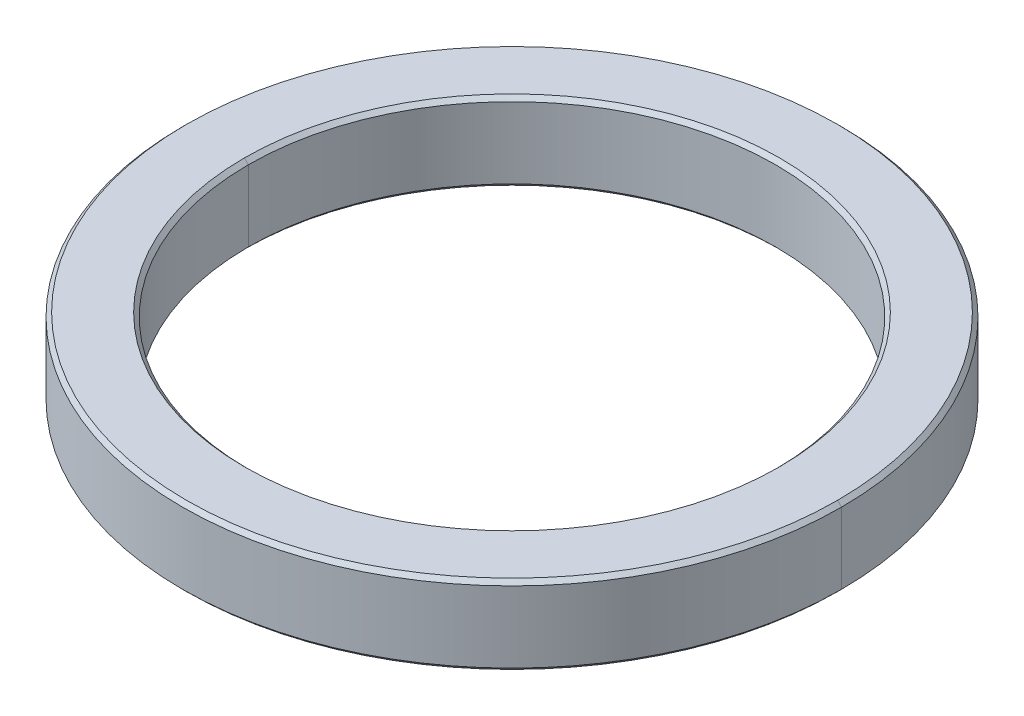
ISO-10303-21;
HEADER;
FILE_DESCRIPTION(('STEP AP214'),'2;1');
FILE_NAME('part.step','',(''),(''),'','','');
FILE_SCHEMA(('AUTOMOTIVE_DESIGN { 1 0 10303 214 1 1 1 1 }'));
ENDSEC;
DATA;
#1=APPLICATION_CONTEXT('core data for automotive mechanical design processes');
#2=APPLICATION_PROTOCOL_DEFINITION('international standard','automotive_design',2000,#1);
#3=PRODUCT_CONTEXT('',#1,'mechanical');
#4=PRODUCT('Part','Part','',(#3));
#5=PRODUCT_RELATED_PRODUCT_CATEGORY('part','',(#4));
#6=PRODUCT_DEFINITION_FORMATION('','',#4);
#7=PRODUCT_DEFINITION_CONTEXT('part definition',#1,'design');
#8=PRODUCT_DEFINITION('design','',#6,#7);
#9=PRODUCT_DEFINITION_SHAPE('','',#8);
#10=(LENGTH_UNIT() NAMED_UNIT(*) SI_UNIT(.MILLI.,.METRE.));
#11=(NAMED_UNIT(*) PLANE_ANGLE_UNIT() SI_UNIT($,.RADIAN.));
#12=(NAMED_UNIT(*) SI_UNIT($,.STERADIAN.) SOLID_ANGLE_UNIT());
#13=UNCERTAINTY_MEASURE_WITH_UNIT(LENGTH_MEASURE(1.E-05),#10,'distance_accuracy_value','');
#14=(GEOMETRIC_REPRESENTATION_CONTEXT(3) GLOBAL_UNCERTAINTY_ASSIGNED_CONTEXT((#13)) GLOBAL_UNIT_ASSIGNED_CONTEXT((#10,
#11,#12)) REPRESENTATION_CONTEXT('',''));
#15=CARTESIAN_POINT('',(0.,0.,0.));
#16=DIRECTION('',(0.,0.,1.));
#17=DIRECTION('',(1.,0.,0.));
#18=AXIS2_PLACEMENT_3D('',#15,#16,#17);
#19=CARTESIAN_POINT('',(0.,0.,0.));
#20=DIRECTION('',(0.,1.,0.));
#21=DIRECTION('',(1.,0.,0.));
#22=AXIS2_PLACEMENT_3D('',#19,#20,#21);
#23=PLANE('',#22);
#24=CARTESIAN_POINT('',(0.,-2.110311925207E-12,0.));
#25=DIRECTION('',(0.,1.,0.));
#26=DIRECTION('',(0.,0.,-1.));
#27=AXIS2_PLACEMENT_3D('',#24,#25,#26);
#28=CIRCLE('',#27,24.7);
#29=CARTESIAN_POINT('',(0.,-2.110311925207E-12,-24.7));
#30=VERTEX_POINT('',#29);
#31=CARTESIAN_POINT('',(-24.7,-2.046363078989E-12,-2.5055922655E-13));
#32=VERTEX_POINT('',#31);
#33=EDGE_CURVE('E42',#30,#32,#28,.T.);
#34=ORIENTED_EDGE('',*,*,#33,.F.);
#35=CARTESIAN_POINT('',(0.,-2.110311925207E-12,0.));
#36=DIRECTION('',(0.,1.,0.));
#37=DIRECTION('',(1.,0.,0.));
#38=AXIS2_PLACEMENT_3D('',#35,#36,#37);
#39=CIRCLE('',#38,24.7);
#40=CARTESIAN_POINT('',(24.7,-2.046363078989E-12,0.));
#41=VERTEX_POINT('',#40);
#42=EDGE_CURVE('E196',#41,#30,#39,.T.);
#43=ORIENTED_EDGE('',*,*,#42,.F.);
#44=CARTESIAN_POINT('',(0.,-2.046363078989E-12,-2.520731328245E-13));
#45=DIRECTION('',(0.,1.,0.));
#46=DIRECTION('',(0.,0.,1.));
#47=AXIS2_PLACEMENT_3D('',#44,#45,#46);
#48=CIRCLE('',#47,24.7);
#49=CARTESIAN_POINT('',(0.,-2.046363078989E-12,24.7));
#50=VERTEX_POINT('',#49);
#51=EDGE_CURVE('E193',#50,#41,#48,.T.);
#52=ORIENTED_EDGE('',*,*,#51,.F.);
#53=CARTESIAN_POINT('',(0.,-2.046363078989E-12,-2.520731328245E-13));
#54=DIRECTION('',(0.,1.,0.));
#55=DIRECTION('',(-1.,0.,0.));
#56=AXIS2_PLACEMENT_3D('',#53,#54,#55);
#57=CIRCLE('',#56,24.7);
#58=EDGE_CURVE('E28',#32,#50,#57,.T.);
#59=ORIENTED_EDGE('',*,*,#58,.F.);
#60=EDGE_LOOP('',(#34,#43,#52,#59));
#61=FACE_BOUND('',#60,.T.);
#62=CARTESIAN_POINT('',(0.,-1.566746732351E-12,0.));
#63=DIRECTION('',(0.,-1.,0.));
#64=DIRECTION('',(0.,0.,-1.));
#65=AXIS2_PLACEMENT_3D('',#62,#63,#64);
#66=CIRCLE('',#65,20.3);
#67=CARTESIAN_POINT('',(0.,-1.566746732351E-12,-20.3));
#68=VERTEX_POINT('',#67);
#69=CARTESIAN_POINT('',(20.3,-1.566746732351E-12,0.));
#70=VERTEX_POINT('',#69);
#71=EDGE_CURVE('E235',#68,#70,#66,.T.);
#72=ORIENTED_EDGE('',*,*,#71,.F.);
#73=CARTESIAN_POINT('',(0.,-1.566746732351E-12,0.));
#74=DIRECTION('',(0.,-1.,0.));
#75=DIRECTION('',(-1.,0.,0.));
#76=AXIS2_PLACEMENT_3D('',#73,#74,#75);
#77=CIRCLE('',#76,20.3);
#78=CARTESIAN_POINT('',(-20.3,-1.566746732351E-12,0.));
#79=VERTEX_POINT('',#78);
#80=EDGE_CURVE('E21',#79,#68,#77,.T.);
#81=ORIENTED_EDGE('',*,*,#80,.F.);
#82=CARTESIAN_POINT('',(0.,-1.566746732351E-12,0.));
#83=DIRECTION('',(0.,-1.,0.));
#84=DIRECTION('',(0.,0.,1.));
#85=AXIS2_PLACEMENT_3D('',#82,#83,#84);
#86=CIRCLE('',#85,20.3);
#87=CARTESIAN_POINT('',(0.,-1.566746732351E-12,20.3));
#88=VERTEX_POINT('',#87);
#89=EDGE_CURVE('E272',#88,#79,#86,.T.);
#90=ORIENTED_EDGE('',*,*,#89,.F.);
#91=CARTESIAN_POINT('',(0.,-1.566746732351E-12,0.));
#92=DIRECTION('',(0.,-1.,0.));
#93=DIRECTION('',(1.,0.,0.));
#94=AXIS2_PLACEMENT_3D('',#91,#92,#93);
#95=CIRCLE('',#94,20.3);
#96=EDGE_CURVE('E276',#70,#88,#95,.T.);
#97=ORIENTED_EDGE('',*,*,#96,.F.);
#98=EDGE_LOOP('',(#72,#81,#90,#97));
#99=FACE_BOUND('',#98,.T.);
#100=ADVANCED_FACE('F17',(#61,#99),#23,.F.);
#101=CARTESIAN_POINT('',(0.,0.149999999998,-2.520731328245E-13));
#102=DIRECTION('',(0.,1.,0.));
#103=DIRECTION('',(0.,0.,-1.));
#104=AXIS2_PLACEMENT_3D('',#101,#102,#103);
#105=CONICAL_SURFACE('',#104,24.85,0.7853981633973);
#106=DIRECTION('',(-0.707106781185698,-0.707106781187397,-1.254819780811E-09));
#107=VECTOR('',#106,1.);
#108=CARTESIAN_POINT('',(25.,0.2999999999991,-1.67764101897E-09));
#109=LINE('',#108,#107);
#110=CARTESIAN_POINT('',(25.,0.2999999999981,0.));
#111=VERTEX_POINT('',#110);
#112=EDGE_CURVE('E201',#111,#41,#109,.T.);
#113=ORIENTED_EDGE('',*,*,#112,.F.);
#114=CARTESIAN_POINT('',(0.,0.2999999999981,-2.520731328245E-13));
#115=DIRECTION('',(0.,1.,0.));
#116=DIRECTION('',(0.,0.,1.));
#117=AXIS2_PLACEMENT_3D('',#114,#115,#116);
#118=CIRCLE('',#117,25.);
#119=CARTESIAN_POINT('',(0.,0.2999999999981,25.));
#120=VERTEX_POINT('',#119);
#121=EDGE_CURVE('E214',#120,#111,#118,.T.);
#122=ORIENTED_EDGE('',*,*,#121,.F.);
#123=CARTESIAN_POINT('',(0.,0.2999999999981,-2.520731328245E-13));
#124=DIRECTION('',(0.,1.,0.));
#125=DIRECTION('',(-1.,0.,1.151365354006E-10));
#126=AXIS2_PLACEMENT_3D('',#123,#124,#125);
#127=CIRCLE('',#126,25.);
#128=CARTESIAN_POINT('',(-25.,0.2999999999991,3.116729008137E-09));
#129=VERTEX_POINT('',#128);
#130=EDGE_CURVE('E216',#129,#120,#127,.T.);
#131=ORIENTED_EDGE('',*,*,#130,.F.);
#132=DIRECTION('',(0.707106781185698,-0.707106781187397,-2.137327921652E-09));
#133=VECTOR('',#132,1.);
#134=CARTESIAN_POINT('',(-25.,0.2999999999991,3.116729008137E-09));
#135=LINE('',#134,#133);
#136=EDGE_CURVE('E11',#129,#32,#135,.T.);
#137=ORIENTED_EDGE('',*,*,#136,.T.);
#138=ORIENTED_EDGE('',*,*,#58,.T.);
#139=ORIENTED_EDGE('',*,*,#51,.T.);
#140=EDGE_LOOP('',(#113,#122,#131,#137,#138,#139));
#141=FACE_BOUND('',#140,.T.);
#142=ADVANCED_FACE('F203',(#141),#105,.T.);
#143=CARTESIAN_POINT('',(0.,0.1499999999979,0.));
#144=DIRECTION('',(0.,1.,0.));
#145=DIRECTION('',(0.,0.,-1.));
#146=AXIS2_PLACEMENT_3D('',#143,#144,#145);
#147=CONICAL_SURFACE('',#146,24.85,0.7853981633973);
#148=ORIENTED_EDGE('',*,*,#136,.F.);
#149=CARTESIAN_POINT('',(0.,0.2999999999979,0.));
#150=DIRECTION('',(0.,1.,0.));
#151=DIRECTION('',(0.,0.,-1.));
#152=AXIS2_PLACEMENT_3D('',#149,#150,#151);
#153=CIRCLE('',#152,25.);
#154=CARTESIAN_POINT('',(0.,0.2999999999979,-25.));
#155=VERTEX_POINT('',#154);
#156=EDGE_CURVE('E229',#155,#129,#153,.T.);
#157=ORIENTED_EDGE('',*,*,#156,.F.);
#158=CARTESIAN_POINT('',(0.,0.2999999999979,0.));
#159=DIRECTION('',(0.,1.,0.));
#160=DIRECTION('',(1.,0.,0.));
#161=AXIS2_PLACEMENT_3D('',#158,#159,#160);
#162=CIRCLE('',#161,25.);
#163=EDGE_CURVE('E233',#111,#155,#162,.T.);
#164=ORIENTED_EDGE('',*,*,#163,.F.);
#165=ORIENTED_EDGE('',*,*,#112,.T.);
#166=ORIENTED_EDGE('',*,*,#42,.T.);
#167=ORIENTED_EDGE('',*,*,#33,.T.);
#168=EDGE_LOOP('',(#148,#157,#164,#165,#166,#167));
#169=FACE_BOUND('',#168,.T.);
#170=ADVANCED_FACE('F375',(#169),#147,.T.);
#171=CARTESIAN_POINT('',(0.,0.,0.));
#172=DIRECTION('',(0.,1.,0.));
#173=DIRECTION('',(1.,0.,0.));
#174=AXIS2_PLACEMENT_3D('',#171,#172,#173);
#175=CYLINDRICAL_SURFACE('',#174,25.);
#176=DIRECTION('',(0.,-1.,0.));
#177=VECTOR('',#176,1.);
#178=CARTESIAN_POINT('',(25.,5.700000000001,-1.677645325336E-09));
#179=LINE('',#178,#177);
#180=CARTESIAN_POINT('',(25.,5.700000000002,0.));
#181=VERTEX_POINT('',#180);
#182=EDGE_CURVE('E256',#181,#111,#179,.T.);
#183=ORIENTED_EDGE('',*,*,#182,.T.);
#184=ORIENTED_EDGE('',*,*,#163,.T.);
#185=ORIENTED_EDGE('',*,*,#156,.T.);
#186=DIRECTION('',(0.,-1.,0.));
#187=VECTOR('',#186,1.);
#188=CARTESIAN_POINT('',(-25.,5.700000000001,3.116731926724E-09));
#189=LINE('',#188,#187);
#190=CARTESIAN_POINT('',(-25.,5.700000000002,2.878161311882E-09));
#191=VERTEX_POINT('',#190);
#192=EDGE_CURVE('E278',#191,#129,#189,.T.);
#193=ORIENTED_EDGE('',*,*,#192,.F.);
#194=CARTESIAN_POINT('',(0.,5.700000000002,0.));
#195=DIRECTION('',(0.,-1.,0.));
#196=DIRECTION('',(-1.,0.,1.151264524753E-10));
#197=AXIS2_PLACEMENT_3D('',#194,#195,#196);
#198=CIRCLE('',#197,25.);
#199=CARTESIAN_POINT('',(0.,5.700000000002,-25.));
#200=VERTEX_POINT('',#199);
#201=EDGE_CURVE('E234',#191,#200,#198,.T.);
#202=ORIENTED_EDGE('',*,*,#201,.T.);
#203=CARTESIAN_POINT('',(0.,5.700000000002,0.));
#204=DIRECTION('',(0.,-1.,0.));
#205=DIRECTION('',(0.,0.,-1.));
#206=AXIS2_PLACEMENT_3D('',#203,#204,#205);
#207=CIRCLE('',#206,25.);
#208=EDGE_CURVE('E252',#200,#181,#207,.T.);
#209=ORIENTED_EDGE('',*,*,#208,.T.);
#210=EDGE_LOOP('',(#183,#184,#185,#193,#202,#209));
#211=FACE_BOUND('',#210,.T.);
#212=ADVANCED_FACE('F362',(#211),#175,.T.);
#213=CARTESIAN_POINT('',(0.,5.850000000002,0.));
#214=DIRECTION('',(0.,-1.,0.));
#215=DIRECTION('',(0.,0.,-1.));
#216=AXIS2_PLACEMENT_3D('',#213,#214,#215);
#217=CONICAL_SURFACE('',#216,24.85,0.7853981633973);
#218=DIRECTION('',(-0.707106781185798,0.707106781187298,-1.255017483175E-09));
#219=VECTOR('',#218,1.);
#220=CARTESIAN_POINT('',(25.,5.700000000001,-1.677645325336E-09));
#221=LINE('',#220,#219);
#222=CARTESIAN_POINT('',(24.7,6.000000000002,-2.468025783742E-13));
#223=VERTEX_POINT('',#222);
#224=EDGE_CURVE('E121',#181,#223,#221,.T.);
#225=ORIENTED_EDGE('',*,*,#224,.F.);
#226=ORIENTED_EDGE('',*,*,#208,.F.);
#227=ORIENTED_EDGE('',*,*,#201,.F.);
#228=DIRECTION('',(0.707106781185798,0.707106781187298,-2.13713125730899E-09));
#229=VECTOR('',#228,1.);
#230=CARTESIAN_POINT('',(-25.,5.700000000001,3.116731926724E-09));
#231=LINE('',#230,#229);
#232=CARTESIAN_POINT('',(-24.7,6.000000000002,0.));
#233=VERTEX_POINT('',#232);
#234=EDGE_CURVE('E255',#191,#233,#231,.T.);
#235=ORIENTED_EDGE('',*,*,#234,.T.);
#236=CARTESIAN_POINT('',(0.,6.000000000002,0.));
#237=DIRECTION('',(0.,-1.,0.));
#238=DIRECTION('',(-1.,0.,0.));
#239=AXIS2_PLACEMENT_3D('',#236,#237,#238);
#240=CIRCLE('',#239,24.7);
#241=CARTESIAN_POINT('',(0.,6.000000000002,-24.7));
#242=VERTEX_POINT('',#241);
#243=EDGE_CURVE('E108',#233,#242,#240,.T.);
#244=ORIENTED_EDGE('',*,*,#243,.T.);
#245=CARTESIAN_POINT('',(0.,6.000000000002,0.));
#246=DIRECTION('',(0.,-1.,0.));
#247=DIRECTION('',(0.,0.,-1.));
#248=AXIS2_PLACEMENT_3D('',#245,#246,#247);
#249=CIRCLE('',#248,24.7);
#250=EDGE_CURVE('E260',#242,#223,#249,.T.);
#251=ORIENTED_EDGE('',*,*,#250,.T.);
#252=EDGE_LOOP('',(#225,#226,#227,#235,#244,#251));
#253=FACE_BOUND('',#252,.T.);
#254=ADVANCED_FACE('F364',(#253),#217,.T.);
#255=CARTESIAN_POINT('',(0.,6.,0.));
#256=DIRECTION('',(0.,1.,0.));
#257=DIRECTION('',(1.,0.,0.));
#258=AXIS2_PLACEMENT_3D('',#255,#256,#257);
#259=PLANE('',#258);
#260=ORIENTED_EDGE('',*,*,#250,.F.);
#261=ORIENTED_EDGE('',*,*,#243,.F.);
#262=CARTESIAN_POINT('',(0.,6.000000000002,-2.520731328245E-13));
#263=DIRECTION('',(0.,-1.,0.));
#264=DIRECTION('',(0.,0.,1.));
#265=AXIS2_PLACEMENT_3D('',#262,#263,#264);
#266=CIRCLE('',#265,24.7);
#267=CARTESIAN_POINT('',(0.,6.000000000002,24.7));
#268=VERTEX_POINT('',#267);
#269=EDGE_CURVE('E282',#268,#233,#266,.T.);
#270=ORIENTED_EDGE('',*,*,#269,.F.);
#271=CARTESIAN_POINT('',(0.,6.000000000002,-2.520731328245E-13));
#272=DIRECTION('',(0.,-1.,0.));
#273=DIRECTION('',(1.,0.,0.));
#274=AXIS2_PLACEMENT_3D('',#271,#272,#273);
#275=CIRCLE('',#274,24.7);
#276=EDGE_CURVE('E304',#223,#268,#275,.T.);
#277=ORIENTED_EDGE('',*,*,#276,.F.);
#278=EDGE_LOOP('',(#260,#261,#270,#277));
#279=FACE_BOUND('',#278,.T.);
#280=CARTESIAN_POINT('',(0.,6.000000000001,0.));
#281=DIRECTION('',(0.,1.,0.));
#282=DIRECTION('',(0.,0.,-1.));
#283=AXIS2_PLACEMENT_3D('',#280,#281,#282);
#284=CIRCLE('',#283,20.3);
#285=CARTESIAN_POINT('',(0.,6.000000000001,-20.3));
#286=VERTEX_POINT('',#285);
#287=CARTESIAN_POINT('',(-20.3,6.000000000001,0.));
#288=VERTEX_POINT('',#287);
#289=EDGE_CURVE('E226',#286,#288,#284,.T.);
#290=ORIENTED_EDGE('',*,*,#289,.F.);
#291=CARTESIAN_POINT('',(0.,6.000000000001,0.));
#292=DIRECTION('',(0.,1.,0.));
#293=DIRECTION('',(1.,0.,0.));
#294=AXIS2_PLACEMENT_3D('',#291,#292,#293);
#295=CIRCLE('',#294,20.3);
#296=CARTESIAN_POINT('',(20.3,6.000000000001,0.));
#297=VERTEX_POINT('',#296);
#298=EDGE_CURVE('E135',#297,#286,#295,.T.);
#299=ORIENTED_EDGE('',*,*,#298,.F.);
#300=CARTESIAN_POINT('',(0.,6.000000000001,0.));
#301=DIRECTION('',(0.,1.,0.));
#302=DIRECTION('',(0.,0.,1.));
#303=AXIS2_PLACEMENT_3D('',#300,#301,#302);
#304=CIRCLE('',#303,20.3);
#305=CARTESIAN_POINT('',(0.,6.000000000001,20.3));
#306=VERTEX_POINT('',#305);
#307=EDGE_CURVE('E143',#306,#297,#304,.T.);
#308=ORIENTED_EDGE('',*,*,#307,.F.);
#309=CARTESIAN_POINT('',(0.,6.000000000001,0.));
#310=DIRECTION('',(0.,1.,0.));
#311=DIRECTION('',(-1.,0.,0.));
#312=AXIS2_PLACEMENT_3D('',#309,#310,#311);
#313=CIRCLE('',#312,20.3);
#314=EDGE_CURVE('E287',#288,#306,#313,.T.);
#315=ORIENTED_EDGE('',*,*,#314,.F.);
#316=EDGE_LOOP('',(#290,#299,#308,#315));
#317=FACE_BOUND('',#316,.T.);
#318=ADVANCED_FACE('F366',(#279,#317),#259,.T.);
#319=CARTESIAN_POINT('',(0.,5.850000000002,-2.520731328245E-13));
#320=DIRECTION('',(0.,-1.,0.));
#321=DIRECTION('',(0.,0.,-1.));
#322=AXIS2_PLACEMENT_3D('',#319,#320,#321);
#323=CONICAL_SURFACE('',#322,24.85,0.7853981633973);
#324=ORIENTED_EDGE('',*,*,#234,.F.);
#325=CARTESIAN_POINT('',(0.,5.700000000002,-2.520731328245E-13));
#326=DIRECTION('',(0.,-1.,0.));
#327=DIRECTION('',(0.,0.,1.));
#328=AXIS2_PLACEMENT_3D('',#325,#326,#327);
#329=CIRCLE('',#328,25.);
#330=CARTESIAN_POINT('',(0.,5.700000000002,25.));
#331=VERTEX_POINT('',#330);
#332=EDGE_CURVE('E158',#331,#191,#329,.T.);
#333=ORIENTED_EDGE('',*,*,#332,.F.);
#334=CARTESIAN_POINT('',(0.,5.700000000002,-2.520731328245E-13));
#335=DIRECTION('',(0.,-1.,0.));
#336=DIRECTION('',(1.,0.,0.));
#337=AXIS2_PLACEMENT_3D('',#334,#335,#336);
#338=CIRCLE('',#337,25.);
#339=EDGE_CURVE('E217',#181,#331,#338,.T.);
#340=ORIENTED_EDGE('',*,*,#339,.F.);
#341=ORIENTED_EDGE('',*,*,#224,.T.);
#342=ORIENTED_EDGE('',*,*,#276,.T.);
#343=ORIENTED_EDGE('',*,*,#269,.T.);
#344=EDGE_LOOP('',(#324,#333,#340,#341,#342,#343));
#345=FACE_BOUND('',#344,.T.);
#346=ADVANCED_FACE('F373',(#345),#323,.T.);
#347=CARTESIAN_POINT('',(0.,0.,0.));
#348=DIRECTION('',(0.,1.,0.));
#349=DIRECTION('',(1.,0.,0.));
#350=AXIS2_PLACEMENT_3D('',#347,#348,#349);
#351=CYLINDRICAL_SURFACE('',#350,25.);
#352=ORIENTED_EDGE('',*,*,#192,.T.);
#353=ORIENTED_EDGE('',*,*,#130,.T.);
#354=ORIENTED_EDGE('',*,*,#121,.T.);
#355=ORIENTED_EDGE('',*,*,#182,.F.);
#356=ORIENTED_EDGE('',*,*,#339,.T.);
#357=ORIENTED_EDGE('',*,*,#332,.T.);
#358=EDGE_LOOP('',(#352,#353,#354,#355,#356,#357));
#359=FACE_BOUND('',#358,.T.);
#360=ADVANCED_FACE('F390',(#359),#351,.T.);
#361=CARTESIAN_POINT('',(0.,5.850000000001,0.));
#362=DIRECTION('',(0.,1.,0.));
#363=DIRECTION('',(0.,0.,-1.));
#364=AXIS2_PLACEMENT_3D('',#361,#362,#363);
#365=CONICAL_SURFACE('',#364,20.15,0.7853981633973);
#366=DIRECTION('',(0.707106781185998,0.707106781187098,-2.13031959488399E-09));
#367=VECTOR('',#366,1.);
#368=CARTESIAN_POINT('',(20.,5.700000000001,-2.557969775334E-09));
#369=LINE('',#368,#367);
#370=CARTESIAN_POINT('',(20.,5.700000000002,0.));
#371=VERTEX_POINT('',#370);
#372=EDGE_CURVE('E244',#371,#297,#369,.T.);
#373=ORIENTED_EDGE('',*,*,#372,.F.);
#374=CARTESIAN_POINT('',(0.,5.700000000002,0.));
#375=DIRECTION('',(0.,1.,0.));
#376=DIRECTION('',(0.,0.,1.));
#377=AXIS2_PLACEMENT_3D('',#374,#375,#376);
#378=CIRCLE('',#377,20.);
#379=CARTESIAN_POINT('',(0.,5.700000000002,20.));
#380=VERTEX_POINT('',#379);
#381=EDGE_CURVE('E167',#380,#371,#378,.T.);
#382=ORIENTED_EDGE('',*,*,#381,.F.);
#383=CARTESIAN_POINT('',(0.,5.700000000002,0.));
#384=DIRECTION('',(0.,1.,0.));
#385=DIRECTION('',(-1.,0.,2.190473243831E-10));
#386=AXIS2_PLACEMENT_3D('',#383,#384,#385);
#387=CIRCLE('',#386,20.);
#388=CARTESIAN_POINT('',(-20.,5.700000000001,4.748444243812E-09));
#389=VERTEX_POINT('',#388);
#390=EDGE_CURVE('E268',#389,#380,#387,.T.);
#391=ORIENTED_EDGE('',*,*,#390,.F.);
#392=DIRECTION('',(-0.707106781185998,0.707106781187098,-3.03267824070499E-09));
#393=VECTOR('',#392,1.);
#394=CARTESIAN_POINT('',(-20.,5.700000000001,4.748444243812E-09));
#395=LINE('',#394,#393);
#396=EDGE_CURVE('E291',#389,#288,#395,.T.);
#397=ORIENTED_EDGE('',*,*,#396,.T.);
#398=ORIENTED_EDGE('',*,*,#314,.T.);
#399=ORIENTED_EDGE('',*,*,#307,.T.);
#400=EDGE_LOOP('',(#373,#382,#391,#397,#398,#399));
#401=FACE_BOUND('',#400,.T.);
#402=ADVANCED_FACE('F386',(#401),#365,.F.);
#403=CARTESIAN_POINT('',(0.,5.850000000001,0.));
#404=DIRECTION('',(0.,1.,0.));
#405=DIRECTION('',(0.,0.,-1.));
#406=AXIS2_PLACEMENT_3D('',#403,#404,#405);
#407=CONICAL_SURFACE('',#406,20.15,0.7853981633973);
#408=ORIENTED_EDGE('',*,*,#396,.F.);
#409=CARTESIAN_POINT('',(0.,5.700000000002,0.));
#410=DIRECTION('',(0.,1.,0.));
#411=DIRECTION('',(0.,0.,-1.));
#412=AXIS2_PLACEMENT_3D('',#409,#410,#411);
#413=CIRCLE('',#412,20.);
#414=CARTESIAN_POINT('',(0.,5.700000000002,-20.));
#415=VERTEX_POINT('',#414);
#416=EDGE_CURVE('E221',#415,#389,#413,.T.);
#417=ORIENTED_EDGE('',*,*,#416,.F.);
#418=CARTESIAN_POINT('',(0.,5.700000000002,0.));
#419=DIRECTION('',(0.,1.,0.));
#420=DIRECTION('',(1.,0.,0.));
#421=AXIS2_PLACEMENT_3D('',#418,#419,#420);
#422=CIRCLE('',#421,20.);
#423=EDGE_CURVE('E248',#371,#415,#422,.T.);
#424=ORIENTED_EDGE('',*,*,#423,.F.);
#425=ORIENTED_EDGE('',*,*,#372,.T.);
#426=ORIENTED_EDGE('',*,*,#298,.T.);
#427=ORIENTED_EDGE('',*,*,#289,.T.);
#428=EDGE_LOOP('',(#408,#417,#424,#425,#426,#427));
#429=FACE_BOUND('',#428,.T.);
#430=ADVANCED_FACE('F389',(#429),#407,.F.);
#431=CARTESIAN_POINT('',(0.,0.,0.));
#432=DIRECTION('',(0.,1.,0.));
#433=DIRECTION('',(1.,0.,0.));
#434=AXIS2_PLACEMENT_3D('',#431,#432,#433);
#435=CYLINDRICAL_SURFACE('',#434,20.);
#436=DIRECTION('',(0.,-1.,0.));
#437=VECTOR('',#436,1.);
#438=CARTESIAN_POINT('',(-20.,5.700000000001,4.748444243812E-09));
#439=LINE('',#438,#437);
#440=CARTESIAN_POINT('',(-20.,0.2999999999984,4.380946487661E-09));
#441=VERTEX_POINT('',#440);
#442=EDGE_CURVE('E223',#389,#441,#439,.T.);
#443=ORIENTED_EDGE('',*,*,#442,.T.);
#444=CARTESIAN_POINT('',(0.,0.2999999999984,0.));
#445=DIRECTION('',(0.,-1.,0.));
#446=DIRECTION('',(-1.,0.,2.190473243831E-10));
#447=AXIS2_PLACEMENT_3D('',#444,#445,#446);
#448=CIRCLE('',#447,20.);
#449=CARTESIAN_POINT('',(0.,0.2999999999984,-20.));
#450=VERTEX_POINT('',#449);
#451=EDGE_CURVE('E227',#441,#450,#448,.T.);
#452=ORIENTED_EDGE('',*,*,#451,.T.);
#453=CARTESIAN_POINT('',(0.,0.2999999999984,0.));
#454=DIRECTION('',(0.,-1.,0.));
#455=DIRECTION('',(0.,0.,-1.));
#456=AXIS2_PLACEMENT_3D('',#453,#454,#455);
#457=CIRCLE('',#456,20.);
#458=CARTESIAN_POINT('',(20.,0.2999999999992,-2.557966559089E-09));
#459=VERTEX_POINT('',#458);
#460=EDGE_CURVE('E251',#450,#459,#457,.T.);
#461=ORIENTED_EDGE('',*,*,#460,.T.);
#462=DIRECTION('',(0.,-1.,0.));
#463=VECTOR('',#462,1.);
#464=CARTESIAN_POINT('',(20.,5.700000000001,-2.557969775334E-09));
#465=LINE('',#464,#463);
#466=EDGE_CURVE('E218',#371,#459,#465,.T.);
#467=ORIENTED_EDGE('',*,*,#466,.F.);
#468=ORIENTED_EDGE('',*,*,#423,.T.);
#469=ORIENTED_EDGE('',*,*,#416,.T.);
#470=EDGE_LOOP('',(#443,#452,#461,#467,#468,#469));
#471=FACE_BOUND('',#470,.T.);
#472=ADVANCED_FACE('F392',(#471),#435,.F.);
#473=CARTESIAN_POINT('',(0.,0.,0.));
#474=DIRECTION('',(0.,1.,0.));
#475=DIRECTION('',(1.,0.,0.));
#476=AXIS2_PLACEMENT_3D('',#473,#474,#475);
#477=CYLINDRICAL_SURFACE('',#476,20.);
#478=ORIENTED_EDGE('',*,*,#466,.T.);
#479=CARTESIAN_POINT('',(0.,0.2999999999984,0.));
#480=DIRECTION('',(0.,-1.,0.));
#481=DIRECTION('',(1.,0.,0.));
#482=AXIS2_PLACEMENT_3D('',#479,#480,#481);
#483=CIRCLE('',#482,20.);
#484=CARTESIAN_POINT('',(0.,0.2999999999984,20.));
#485=VERTEX_POINT('',#484);
#486=EDGE_CURVE('E222',#459,#485,#483,.T.);
#487=ORIENTED_EDGE('',*,*,#486,.T.);
#488=CARTESIAN_POINT('',(0.,0.2999999999984,0.));
#489=DIRECTION('',(0.,-1.,0.));
#490=DIRECTION('',(0.,0.,1.));
#491=AXIS2_PLACEMENT_3D('',#488,#489,#490);
#492=CIRCLE('',#491,20.);
#493=EDGE_CURVE('E271',#485,#441,#492,.T.);
#494=ORIENTED_EDGE('',*,*,#493,.T.);
#495=ORIENTED_EDGE('',*,*,#442,.F.);
#496=ORIENTED_EDGE('',*,*,#390,.T.);
#497=ORIENTED_EDGE('',*,*,#381,.T.);
#498=EDGE_LOOP('',(#478,#487,#494,#495,#496,#497));
#499=FACE_BOUND('',#498,.T.);
#500=ADVANCED_FACE('F19',(#499),#477,.F.);
#501=CARTESIAN_POINT('',(0.,0.1499999999984,0.));
#502=DIRECTION('',(0.,-1.,0.));
#503=DIRECTION('',(0.,0.,-1.));
#504=AXIS2_PLACEMENT_3D('',#501,#502,#503);
#505=CONICAL_SURFACE('',#504,20.15,0.7853981633973);
#506=DIRECTION('',(-0.707106781185898,-0.707106781187197,-3.03267917402699E-09));
#507=VECTOR('',#506,1.);
#508=CARTESIAN_POINT('',(-20.,0.2999999999992,4.748445468459E-09));
#509=LINE('',#508,#507);
#510=EDGE_CURVE('E277',#441,#79,#509,.T.);
#511=ORIENTED_EDGE('',*,*,#510,.F.);
#512=ORIENTED_EDGE('',*,*,#493,.F.);
#513=ORIENTED_EDGE('',*,*,#486,.F.);
#514=DIRECTION('',(0.707106781185898,-0.707106781187197,-2.130314963121E-09));
#515=VECTOR('',#514,1.);
#516=CARTESIAN_POINT('',(20.,0.2999999999992,-2.557966559089E-09));
#517=LINE('',#516,#515);
#518=EDGE_CURVE('E212',#459,#70,#517,.T.);
#519=ORIENTED_EDGE('',*,*,#518,.T.);
#520=ORIENTED_EDGE('',*,*,#96,.T.);
#521=ORIENTED_EDGE('',*,*,#89,.T.);
#522=EDGE_LOOP('',(#511,#512,#513,#519,#520,#521));
#523=FACE_BOUND('',#522,.T.);
#524=ADVANCED_FACE('F346',(#523),#505,.F.);
#525=CARTESIAN_POINT('',(0.,0.1499999999984,0.));
#526=DIRECTION('',(0.,-1.,0.));
#527=DIRECTION('',(0.,0.,-1.));
#528=AXIS2_PLACEMENT_3D('',#525,#526,#527);
#529=CONICAL_SURFACE('',#528,20.15,0.7853981633973);
#530=ORIENTED_EDGE('',*,*,#518,.F.);
#531=ORIENTED_EDGE('',*,*,#460,.F.);
#532=ORIENTED_EDGE('',*,*,#451,.F.);
#533=ORIENTED_EDGE('',*,*,#510,.T.);
#534=ORIENTED_EDGE('',*,*,#80,.T.);
#535=ORIENTED_EDGE('',*,*,#71,.T.);
#536=EDGE_LOOP('',(#530,#531,#532,#533,#534,#535));
#537=FACE_BOUND('',#536,.T.);
#538=ADVANCED_FACE('F341',(#537),#529,.F.);
#539=CLOSED_SHELL('',(#100,#142,#170,#212,#254,#318,#346,#360,#402,#430,#472,#500,#524,#538));
#540=MANIFOLD_SOLID_BREP('B1',#539);
#541=ADVANCED_BREP_SHAPE_REPRESENTATION('',(#18,#540),#14);
#542=SHAPE_DEFINITION_REPRESENTATION(#9,#541);
ENDSEC;
END-ISO-10303-21;
